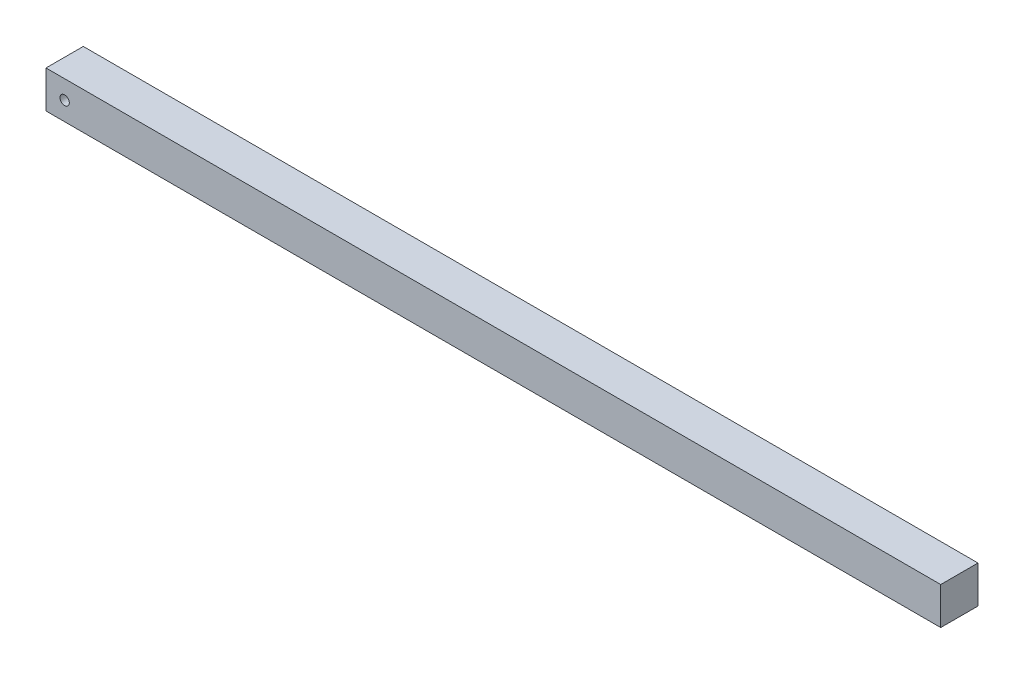
ISO-10303-21;
HEADER;
FILE_DESCRIPTION(('STEP AP214'),'2;1');
FILE_NAME('part.step','',(''),(''),'','','');
FILE_SCHEMA(('AUTOMOTIVE_DESIGN { 1 0 10303 214 1 1 1 1 }'));
ENDSEC;
DATA;
#1=APPLICATION_CONTEXT('core data for automotive mechanical design processes');
#2=APPLICATION_PROTOCOL_DEFINITION('international standard','automotive_design',2000,#1);
#3=PRODUCT_CONTEXT('',#1,'mechanical');
#4=PRODUCT('Part','Part','',(#3));
#5=PRODUCT_RELATED_PRODUCT_CATEGORY('part','',(#4));
#6=PRODUCT_DEFINITION_FORMATION('','',#4);
#7=PRODUCT_DEFINITION_CONTEXT('part definition',#1,'design');
#8=PRODUCT_DEFINITION('design','',#6,#7);
#9=PRODUCT_DEFINITION_SHAPE('','',#8);
#10=(LENGTH_UNIT() NAMED_UNIT(*) SI_UNIT(.MILLI.,.METRE.));
#11=(NAMED_UNIT(*) PLANE_ANGLE_UNIT() SI_UNIT($,.RADIAN.));
#12=(NAMED_UNIT(*) SI_UNIT($,.STERADIAN.) SOLID_ANGLE_UNIT());
#13=UNCERTAINTY_MEASURE_WITH_UNIT(LENGTH_MEASURE(1.E-05),#10,'distance_accuracy_value','');
#14=(GEOMETRIC_REPRESENTATION_CONTEXT(3) GLOBAL_UNCERTAINTY_ASSIGNED_CONTEXT((#13)) GLOBAL_UNIT_ASSIGNED_CONTEXT((#10,
#11,#12)) REPRESENTATION_CONTEXT('',''));
#15=CARTESIAN_POINT('',(0.,0.,0.));
#16=DIRECTION('',(0.,0.,1.));
#17=DIRECTION('',(1.,0.,0.));
#18=AXIS2_PLACEMENT_3D('',#15,#16,#17);
#19=CARTESIAN_POINT('',(609.6,0.,0.));
#20=DIRECTION('',(0.,0.,-1.));
#21=DIRECTION('',(0.,1.,0.));
#22=AXIS2_PLACEMENT_3D('',#19,#20,#21);
#23=PLANE('',#22);
#24=CARTESIAN_POINT('',(12.7,-12.7,0.));
#25=DIRECTION('',(0.,0.,1.));
#26=DIRECTION('',(1.,0.,0.));
#27=AXIS2_PLACEMENT_3D('',#24,#25,#26);
#28=CIRCLE('',#27,3.175);
#29=CARTESIAN_POINT('',(15.875,-12.7,0.));
#30=VERTEX_POINT('',#29);
#31=EDGE_CURVE('E110',#30,#30,#28,.T.);
#32=ORIENTED_EDGE('',*,*,#31,.F.);
#33=EDGE_LOOP('',(#32));
#34=FACE_BOUND('',#33,.T.);
#35=DIRECTION('',(0.,-1.,0.));
#36=VECTOR('',#35,1.);
#37=CARTESIAN_POINT('',(0.,0.,0.));
#38=LINE('',#37,#36);
#39=CARTESIAN_POINT('',(0.,0.,0.));
#40=VERTEX_POINT('',#39);
#41=CARTESIAN_POINT('',(0.,-25.4,0.));
#42=VERTEX_POINT('',#41);
#43=EDGE_CURVE('E96',#40,#42,#38,.T.);
#44=ORIENTED_EDGE('',*,*,#43,.T.);
#45=DIRECTION('',(-1.,0.,0.));
#46=VECTOR('',#45,1.);
#47=CARTESIAN_POINT('',(609.6,-25.4,0.));
#48=LINE('',#47,#46);
#49=CARTESIAN_POINT('',(609.6,-25.4,0.));
#50=VERTEX_POINT('',#49);
#51=EDGE_CURVE('E11',#50,#42,#48,.T.);
#52=ORIENTED_EDGE('',*,*,#51,.F.);
#53=DIRECTION('',(0.,-1.,0.));
#54=VECTOR('',#53,1.);
#55=CARTESIAN_POINT('',(609.6,0.,0.));
#56=LINE('',#55,#54);
#57=CARTESIAN_POINT('',(609.6,0.,0.));
#58=VERTEX_POINT('',#57);
#59=EDGE_CURVE('E84',#58,#50,#56,.T.);
#60=ORIENTED_EDGE('',*,*,#59,.F.);
#61=DIRECTION('',(-1.,0.,0.));
#62=VECTOR('',#61,1.);
#63=CARTESIAN_POINT('',(609.6,0.,0.));
#64=LINE('',#63,#62);
#65=EDGE_CURVE('E92',#58,#40,#64,.T.);
#66=ORIENTED_EDGE('',*,*,#65,.T.);
#67=EDGE_LOOP('',(#44,#52,#60,#66));
#68=FACE_BOUND('',#67,.T.);
#69=ADVANCED_FACE('F33',(#34,#68),#23,.F.);
#70=CARTESIAN_POINT('',(609.6,-25.4,0.));
#71=DIRECTION('',(0.,1.,0.));
#72=DIRECTION('',(0.,0.,1.));
#73=AXIS2_PLACEMENT_3D('',#70,#71,#72);
#74=PLANE('',#73);
#75=DIRECTION('',(0.,0.,-1.));
#76=VECTOR('',#75,1.);
#77=CARTESIAN_POINT('',(0.,-25.4,0.));
#78=LINE('',#77,#76);
#79=CARTESIAN_POINT('',(0.,-25.4,-25.4));
#80=VERTEX_POINT('',#79);
#81=EDGE_CURVE('E88',#42,#80,#78,.T.);
#82=ORIENTED_EDGE('',*,*,#81,.T.);
#83=DIRECTION('',(-1.,0.,0.));
#84=VECTOR('',#83,1.);
#85=CARTESIAN_POINT('',(609.6,-25.4,-25.4));
#86=LINE('',#85,#84);
#87=CARTESIAN_POINT('',(609.6,-25.4,-25.4));
#88=VERTEX_POINT('',#87);
#89=EDGE_CURVE('E41',#88,#80,#86,.T.);
#90=ORIENTED_EDGE('',*,*,#89,.F.);
#91=DIRECTION('',(0.,0.,-1.));
#92=VECTOR('',#91,1.);
#93=CARTESIAN_POINT('',(609.6,-25.4,0.));
#94=LINE('',#93,#92);
#95=EDGE_CURVE('E79',#50,#88,#94,.T.);
#96=ORIENTED_EDGE('',*,*,#95,.F.);
#97=ORIENTED_EDGE('',*,*,#51,.T.);
#98=EDGE_LOOP('',(#82,#90,#96,#97));
#99=FACE_BOUND('',#98,.T.);
#100=ADVANCED_FACE('F87',(#99),#74,.F.);
#101=CARTESIAN_POINT('',(609.6,0.,-25.4));
#102=DIRECTION('',(0.,0.,1.));
#103=DIRECTION('',(0.,-1.,0.));
#104=AXIS2_PLACEMENT_3D('',#101,#102,#103);
#105=PLANE('',#104);
#106=CARTESIAN_POINT('',(12.7,-12.7,-25.4));
#107=DIRECTION('',(0.,0.,1.));
#108=DIRECTION('',(1.,0.,0.));
#109=AXIS2_PLACEMENT_3D('',#106,#107,#108);
#110=CIRCLE('',#109,3.175);
#111=CARTESIAN_POINT('',(15.875,-12.7,-25.4));
#112=VERTEX_POINT('',#111);
#113=EDGE_CURVE('E99',#112,#112,#110,.T.);
#114=ORIENTED_EDGE('',*,*,#113,.T.);
#115=EDGE_LOOP('',(#114));
#116=FACE_BOUND('',#115,.T.);
#117=DIRECTION('',(0.,1.,0.));
#118=VECTOR('',#117,1.);
#119=CARTESIAN_POINT('',(0.,0.,-25.4));
#120=LINE('',#119,#118);
#121=CARTESIAN_POINT('',(0.,0.,-25.4));
#122=VERTEX_POINT('',#121);
#123=EDGE_CURVE('E66',#80,#122,#120,.T.);
#124=ORIENTED_EDGE('',*,*,#123,.T.);
#125=DIRECTION('',(-1.,0.,0.));
#126=VECTOR('',#125,1.);
#127=CARTESIAN_POINT('',(609.6,0.,-25.4));
#128=LINE('',#127,#126);
#129=CARTESIAN_POINT('',(609.6,0.,-25.4));
#130=VERTEX_POINT('',#129);
#131=EDGE_CURVE('E89',#130,#122,#128,.T.);
#132=ORIENTED_EDGE('',*,*,#131,.F.);
#133=DIRECTION('',(0.,1.,0.));
#134=VECTOR('',#133,1.);
#135=CARTESIAN_POINT('',(609.6,0.,-25.4));
#136=LINE('',#135,#134);
#137=EDGE_CURVE('E82',#88,#130,#136,.T.);
#138=ORIENTED_EDGE('',*,*,#137,.F.);
#139=ORIENTED_EDGE('',*,*,#89,.T.);
#140=EDGE_LOOP('',(#124,#132,#138,#139));
#141=FACE_BOUND('',#140,.T.);
#142=ADVANCED_FACE('F90',(#116,#141),#105,.F.);
#143=CARTESIAN_POINT('',(609.6,0.,0.));
#144=DIRECTION('',(0.,-1.,0.));
#145=DIRECTION('',(0.,0.,-1.));
#146=AXIS2_PLACEMENT_3D('',#143,#144,#145);
#147=PLANE('',#146);
#148=DIRECTION('',(0.,0.,1.));
#149=VECTOR('',#148,1.);
#150=CARTESIAN_POINT('',(0.,0.,0.));
#151=LINE('',#150,#149);
#152=EDGE_CURVE('E72',#122,#40,#151,.T.);
#153=ORIENTED_EDGE('',*,*,#152,.T.);
#154=ORIENTED_EDGE('',*,*,#65,.F.);
#155=DIRECTION('',(0.,0.,1.));
#156=VECTOR('',#155,1.);
#157=CARTESIAN_POINT('',(609.6,0.,0.));
#158=LINE('',#157,#156);
#159=EDGE_CURVE('E49',#130,#58,#158,.T.);
#160=ORIENTED_EDGE('',*,*,#159,.F.);
#161=ORIENTED_EDGE('',*,*,#131,.T.);
#162=EDGE_LOOP('',(#153,#154,#160,#161));
#163=FACE_BOUND('',#162,.T.);
#164=ADVANCED_FACE('F104',(#163),#147,.F.);
#165=CARTESIAN_POINT('',(609.6,0.,0.));
#166=DIRECTION('',(1.,0.,0.));
#167=DIRECTION('',(0.,0.,-1.));
#168=AXIS2_PLACEMENT_3D('',#165,#166,#167);
#169=PLANE('',#168);
#170=ORIENTED_EDGE('',*,*,#59,.T.);
#171=ORIENTED_EDGE('',*,*,#95,.T.);
#172=ORIENTED_EDGE('',*,*,#137,.T.);
#173=ORIENTED_EDGE('',*,*,#159,.T.);
#174=EDGE_LOOP('',(#170,#171,#172,#173));
#175=FACE_BOUND('',#174,.T.);
#176=ADVANCED_FACE('F80',(#175),#169,.T.);
#177=CARTESIAN_POINT('',(0.,0.,0.));
#178=DIRECTION('',(1.,0.,0.));
#179=DIRECTION('',(0.,0.,-1.));
#180=AXIS2_PLACEMENT_3D('',#177,#178,#179);
#181=PLANE('',#180);
#182=ORIENTED_EDGE('',*,*,#43,.F.);
#183=ORIENTED_EDGE('',*,*,#152,.F.);
#184=ORIENTED_EDGE('',*,*,#123,.F.);
#185=ORIENTED_EDGE('',*,*,#81,.F.);
#186=EDGE_LOOP('',(#182,#183,#184,#185));
#187=FACE_BOUND('',#186,.T.);
#188=ADVANCED_FACE('F107',(#187),#181,.F.);
#189=CARTESIAN_POINT('',(12.7,-12.7,-25.4));
#190=DIRECTION('',(0.,0.,1.));
#191=DIRECTION('',(1.,0.,0.));
#192=AXIS2_PLACEMENT_3D('',#189,#190,#191);
#193=CYLINDRICAL_SURFACE('',#192,3.175);
#194=ORIENTED_EDGE('',*,*,#113,.F.);
#195=EDGE_LOOP('',(#194));
#196=FACE_BOUND('',#195,.T.);
#197=ORIENTED_EDGE('',*,*,#31,.T.);
#198=EDGE_LOOP('',(#197));
#199=FACE_BOUND('',#198,.T.);
#200=ADVANCED_FACE('F117',(#196,#199),#193,.F.);
#201=CLOSED_SHELL('',(#69,#100,#142,#164,#176,#188,#200));
#202=MANIFOLD_SOLID_BREP('B2',#201);
#203=ADVANCED_BREP_SHAPE_REPRESENTATION('',(#18,#202),#14);
#204=SHAPE_DEFINITION_REPRESENTATION(#9,#203);
ENDSEC;
END-ISO-10303-21;
